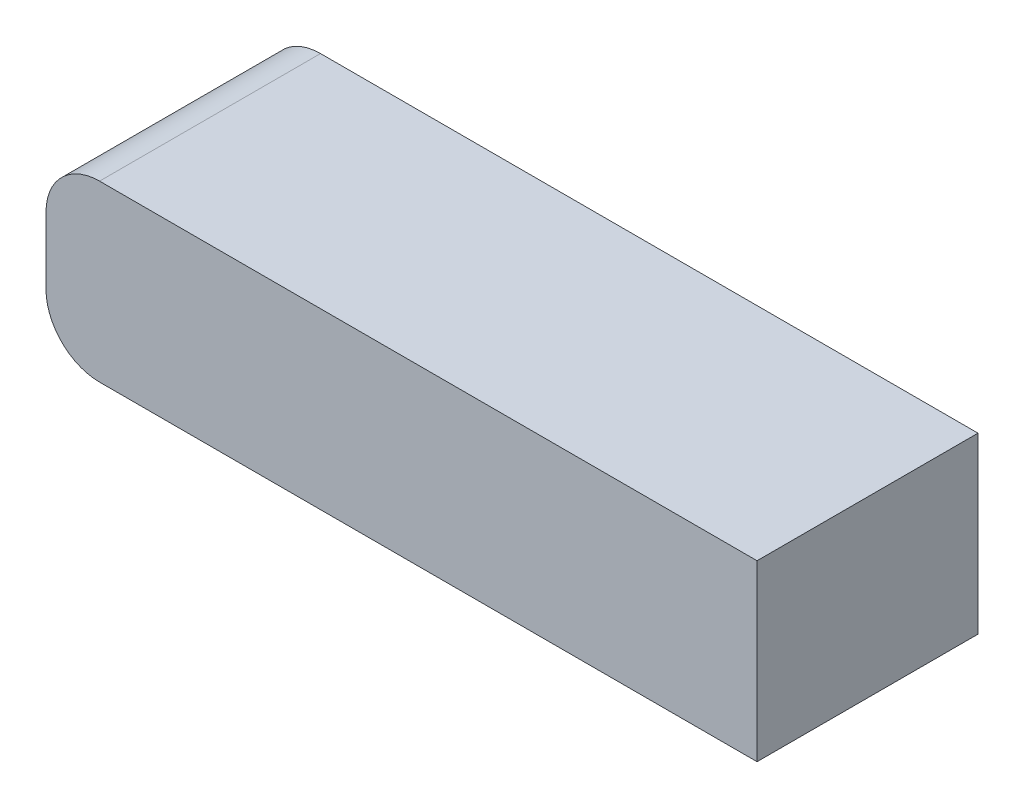
ISO-10303-21;
HEADER;
FILE_DESCRIPTION(('STEP AP214'),'2;1');
FILE_NAME('part.step','',(''),(''),'','','');
FILE_SCHEMA(('AUTOMOTIVE_DESIGN { 1 0 10303 214 1 1 1 1 }'));
ENDSEC;
DATA;
#1=APPLICATION_CONTEXT('core data for automotive mechanical design processes');
#2=APPLICATION_PROTOCOL_DEFINITION('international standard','automotive_design',2000,#1);
#3=PRODUCT_CONTEXT('',#1,'mechanical');
#4=PRODUCT('Part','Part','',(#3));
#5=PRODUCT_RELATED_PRODUCT_CATEGORY('part','',(#4));
#6=PRODUCT_DEFINITION_FORMATION('','',#4);
#7=PRODUCT_DEFINITION_CONTEXT('part definition',#1,'design');
#8=PRODUCT_DEFINITION('design','',#6,#7);
#9=PRODUCT_DEFINITION_SHAPE('','',#8);
#10=(LENGTH_UNIT() NAMED_UNIT(*) SI_UNIT(.MILLI.,.METRE.));
#11=(NAMED_UNIT(*) PLANE_ANGLE_UNIT() SI_UNIT($,.RADIAN.));
#12=(NAMED_UNIT(*) SI_UNIT($,.STERADIAN.) SOLID_ANGLE_UNIT());
#13=UNCERTAINTY_MEASURE_WITH_UNIT(LENGTH_MEASURE(1.E-05),#10,'distance_accuracy_value','');
#14=(GEOMETRIC_REPRESENTATION_CONTEXT(3) GLOBAL_UNCERTAINTY_ASSIGNED_CONTEXT((#13)) GLOBAL_UNIT_ASSIGNED_CONTEXT((#10,
#11,#12)) REPRESENTATION_CONTEXT('',''));
#15=CARTESIAN_POINT('',(0.,0.,0.));
#16=DIRECTION('',(0.,0.,1.));
#17=DIRECTION('',(1.,0.,0.));
#18=AXIS2_PLACEMENT_3D('',#15,#16,#17);
#19=CARTESIAN_POINT('',(67.437,33.02,20.955));
#20=DIRECTION('',(-1.,0.,0.));
#21=DIRECTION('',(0.,0.,1.));
#22=AXIS2_PLACEMENT_3D('',#19,#20,#21);
#23=PLANE('',#22);
#24=DIRECTION('',(0.,0.,-1.));
#25=VECTOR('',#24,1.);
#26=CARTESIAN_POINT('',(67.437,0.,20.955));
#27=LINE('',#26,#25);
#28=CARTESIAN_POINT('',(67.437,0.,20.955));
#29=VERTEX_POINT('',#28);
#30=CARTESIAN_POINT('',(67.437,0.,-20.955));
#31=VERTEX_POINT('',#30);
#32=EDGE_CURVE('E112',#29,#31,#27,.T.);
#33=ORIENTED_EDGE('',*,*,#32,.T.);
#34=DIRECTION('',(0.,-1.,0.));
#35=VECTOR('',#34,1.);
#36=CARTESIAN_POINT('',(67.437,33.02,-20.955));
#37=LINE('',#36,#35);
#38=CARTESIAN_POINT('',(67.437,33.02,-20.955));
#39=VERTEX_POINT('',#38);
#40=EDGE_CURVE('E96',#39,#31,#37,.T.);
#41=ORIENTED_EDGE('',*,*,#40,.F.);
#42=DIRECTION('',(0.,0.,-1.));
#43=VECTOR('',#42,1.);
#44=CARTESIAN_POINT('',(67.437,33.02,20.955));
#45=LINE('',#44,#43);
#46=CARTESIAN_POINT('',(67.437,33.02,20.955));
#47=VERTEX_POINT('',#46);
#48=EDGE_CURVE('E101',#47,#39,#45,.T.);
#49=ORIENTED_EDGE('',*,*,#48,.F.);
#50=DIRECTION('',(0.,-1.,0.));
#51=VECTOR('',#50,1.);
#52=CARTESIAN_POINT('',(67.437,33.02,20.955));
#53=LINE('',#52,#51);
#54=EDGE_CURVE('E147',#47,#29,#53,.T.);
#55=ORIENTED_EDGE('',*,*,#54,.T.);
#56=EDGE_LOOP('',(#33,#41,#49,#55));
#57=FACE_BOUND('',#56,.T.);
#58=ADVANCED_FACE('F39',(#57),#23,.F.);
#59=CARTESIAN_POINT('',(-67.437,33.02,-20.955));
#60=DIRECTION('',(0.,0.,1.));
#61=DIRECTION('',(1.,0.,0.));
#62=AXIS2_PLACEMENT_3D('',#59,#60,#61);
#63=PLANE('',#62);
#64=DIRECTION('',(-1.,0.,0.));
#65=VECTOR('',#64,1.);
#66=CARTESIAN_POINT('',(-67.437,0.,-20.955));
#67=LINE('',#66,#65);
#68=CARTESIAN_POINT('',(-57.277,0.,-20.955));
#69=VERTEX_POINT('',#68);
#70=EDGE_CURVE('E131',#31,#69,#67,.T.);
#71=ORIENTED_EDGE('',*,*,#70,.T.);
#72=CARTESIAN_POINT('',(-57.277,10.16,-20.955));
#73=DIRECTION('',(0.,0.,1.));
#74=DIRECTION('',(1.,0.,0.));
#75=AXIS2_PLACEMENT_3D('',#72,#73,#74);
#76=CIRCLE('',#75,10.16);
#77=CARTESIAN_POINT('',(-67.437,10.16,-20.955));
#78=VERTEX_POINT('',#77);
#79=EDGE_CURVE('E47',#69,#78,#76,.F.);
#80=ORIENTED_EDGE('',*,*,#79,.T.);
#81=DIRECTION('',(0.,-1.,0.));
#82=VECTOR('',#81,1.);
#83=CARTESIAN_POINT('',(-67.437,33.02,-20.955));
#84=LINE('',#83,#82);
#85=CARTESIAN_POINT('',(-67.437,22.86,-20.955));
#86=VERTEX_POINT('',#85);
#87=EDGE_CURVE('E114',#86,#78,#84,.T.);
#88=ORIENTED_EDGE('',*,*,#87,.F.);
#89=CARTESIAN_POINT('',(-57.277,22.86,-20.955));
#90=DIRECTION('',(0.,0.,1.));
#91=DIRECTION('',(1.,0.,0.));
#92=AXIS2_PLACEMENT_3D('',#89,#90,#91);
#93=CIRCLE('',#92,10.16);
#94=CARTESIAN_POINT('',(-57.277,33.02,-20.955));
#95=VERTEX_POINT('',#94);
#96=EDGE_CURVE('E54',#86,#95,#93,.F.);
#97=ORIENTED_EDGE('',*,*,#96,.T.);
#98=DIRECTION('',(-1.,0.,0.));
#99=VECTOR('',#98,1.);
#100=CARTESIAN_POINT('',(-67.437,33.02,-20.955));
#101=LINE('',#100,#99);
#102=EDGE_CURVE('E92',#39,#95,#101,.T.);
#103=ORIENTED_EDGE('',*,*,#102,.F.);
#104=ORIENTED_EDGE('',*,*,#40,.T.);
#105=EDGE_LOOP('',(#71,#80,#88,#97,#103,#104));
#106=FACE_BOUND('',#105,.T.);
#107=ADVANCED_FACE('F94',(#106),#63,.F.);
#108=CARTESIAN_POINT('',(-67.437,33.02,20.955));
#109=DIRECTION('',(1.,0.,0.));
#110=DIRECTION('',(0.,0.,-1.));
#111=AXIS2_PLACEMENT_3D('',#108,#109,#110);
#112=PLANE('',#111);
#113=ORIENTED_EDGE('',*,*,#87,.T.);
#114=DIRECTION('',(0.,0.,1.));
#115=VECTOR('',#114,1.);
#116=CARTESIAN_POINT('',(-67.437,10.16,20.955));
#117=LINE('',#116,#115);
#118=CARTESIAN_POINT('',(-67.437,10.16,20.955));
#119=VERTEX_POINT('',#118);
#120=EDGE_CURVE('E116',#78,#119,#117,.T.);
#121=ORIENTED_EDGE('',*,*,#120,.T.);
#122=DIRECTION('',(0.,-1.,0.));
#123=VECTOR('',#122,1.);
#124=CARTESIAN_POINT('',(-67.437,33.02,20.955));
#125=LINE('',#124,#123);
#126=CARTESIAN_POINT('',(-67.437,22.86,20.955));
#127=VERTEX_POINT('',#126);
#128=EDGE_CURVE('E119',#127,#119,#125,.T.);
#129=ORIENTED_EDGE('',*,*,#128,.F.);
#130=DIRECTION('',(0.,0.,1.));
#131=VECTOR('',#130,1.);
#132=CARTESIAN_POINT('',(-67.437,22.86,20.955));
#133=LINE('',#132,#131);
#134=EDGE_CURVE('E113',#127,#86,#133,.F.);
#135=ORIENTED_EDGE('',*,*,#134,.T.);
#136=EDGE_LOOP('',(#113,#121,#129,#135));
#137=FACE_BOUND('',#136,.T.);
#138=ADVANCED_FACE('F135',(#137),#112,.F.);
#139=CARTESIAN_POINT('',(-67.437,33.02,20.955));
#140=DIRECTION('',(0.,0.,-1.));
#141=DIRECTION('',(-1.,0.,0.));
#142=AXIS2_PLACEMENT_3D('',#139,#140,#141);
#143=PLANE('',#142);
#144=ORIENTED_EDGE('',*,*,#128,.T.);
#145=CARTESIAN_POINT('',(-57.277,10.16,20.955));
#146=DIRECTION('',(0.,0.,-1.));
#147=DIRECTION('',(-1.,0.,0.));
#148=AXIS2_PLACEMENT_3D('',#145,#146,#147);
#149=CIRCLE('',#148,10.16);
#150=CARTESIAN_POINT('',(-57.277,0.,20.955));
#151=VERTEX_POINT('',#150);
#152=EDGE_CURVE('E127',#119,#151,#149,.F.);
#153=ORIENTED_EDGE('',*,*,#152,.T.);
#154=DIRECTION('',(1.,0.,0.));
#155=VECTOR('',#154,1.);
#156=CARTESIAN_POINT('',(-67.437,0.,20.955));
#157=LINE('',#156,#155);
#158=EDGE_CURVE('E109',#151,#29,#157,.T.);
#159=ORIENTED_EDGE('',*,*,#158,.T.);
#160=ORIENTED_EDGE('',*,*,#54,.F.);
#161=DIRECTION('',(1.,0.,0.));
#162=VECTOR('',#161,1.);
#163=CARTESIAN_POINT('',(-67.437,33.02,20.955));
#164=LINE('',#163,#162);
#165=CARTESIAN_POINT('',(-57.277,33.02,20.955));
#166=VERTEX_POINT('',#165);
#167=EDGE_CURVE('E100',#166,#47,#164,.T.);
#168=ORIENTED_EDGE('',*,*,#167,.F.);
#169=CARTESIAN_POINT('',(-57.277,22.86,20.955));
#170=DIRECTION('',(0.,0.,-1.));
#171=DIRECTION('',(-1.,0.,0.));
#172=AXIS2_PLACEMENT_3D('',#169,#170,#171);
#173=CIRCLE('',#172,10.16);
#174=EDGE_CURVE('E125',#166,#127,#173,.F.);
#175=ORIENTED_EDGE('',*,*,#174,.T.);
#176=EDGE_LOOP('',(#144,#153,#159,#160,#168,#175));
#177=FACE_BOUND('',#176,.T.);
#178=ADVANCED_FACE('F141',(#177),#143,.F.);
#179=CARTESIAN_POINT('',(0.,33.02,0.));
#180=DIRECTION('',(0.,-1.,0.));
#181=DIRECTION('',(0.,0.,-1.));
#182=AXIS2_PLACEMENT_3D('',#179,#180,#181);
#183=PLANE('',#182);
#184=ORIENTED_EDGE('',*,*,#102,.T.);
#185=DIRECTION('',(0.,0.,1.));
#186=VECTOR('',#185,1.);
#187=CARTESIAN_POINT('',(-57.277,33.02,0.));
#188=LINE('',#187,#186);
#189=EDGE_CURVE('E11',#95,#166,#188,.T.);
#190=ORIENTED_EDGE('',*,*,#189,.T.);
#191=ORIENTED_EDGE('',*,*,#167,.T.);
#192=ORIENTED_EDGE('',*,*,#48,.T.);
#193=EDGE_LOOP('',(#184,#190,#191,#192));
#194=FACE_BOUND('',#193,.T.);
#195=ADVANCED_FACE('F104',(#194),#183,.F.);
#196=CARTESIAN_POINT('',(0.,0.,0.));
#197=DIRECTION('',(0.,-1.,0.));
#198=DIRECTION('',(0.,0.,-1.));
#199=AXIS2_PLACEMENT_3D('',#196,#197,#198);
#200=PLANE('',#199);
#201=ORIENTED_EDGE('',*,*,#158,.F.);
#202=DIRECTION('',(0.,0.,1.));
#203=VECTOR('',#202,1.);
#204=CARTESIAN_POINT('',(-57.277,0.,-20.955));
#205=LINE('',#204,#203);
#206=EDGE_CURVE('E62',#151,#69,#205,.F.);
#207=ORIENTED_EDGE('',*,*,#206,.T.);
#208=ORIENTED_EDGE('',*,*,#70,.F.);
#209=ORIENTED_EDGE('',*,*,#32,.F.);
#210=EDGE_LOOP('',(#201,#207,#208,#209));
#211=FACE_BOUND('',#210,.T.);
#212=ADVANCED_FACE('F142',(#211),#200,.T.);
#213=CARTESIAN_POINT('',(-57.277,10.16,20.955));
#214=DIRECTION('',(0.,0.,-1.));
#215=DIRECTION('',(-1.,0.,0.));
#216=AXIS2_PLACEMENT_3D('',#213,#214,#215);
#217=CYLINDRICAL_SURFACE('',#216,10.16);
#218=ORIENTED_EDGE('',*,*,#79,.F.);
#219=ORIENTED_EDGE('',*,*,#206,.F.);
#220=ORIENTED_EDGE('',*,*,#152,.F.);
#221=ORIENTED_EDGE('',*,*,#120,.F.);
#222=EDGE_LOOP('',(#218,#219,#220,#221));
#223=FACE_BOUND('',#222,.T.);
#224=ADVANCED_FACE('F139',(#223),#217,.T.);
#225=CARTESIAN_POINT('',(-57.277,22.86,0.));
#226=DIRECTION('',(0.,0.,1.));
#227=DIRECTION('',(1.,0.,0.));
#228=AXIS2_PLACEMENT_3D('',#225,#226,#227);
#229=CYLINDRICAL_SURFACE('',#228,10.16);
#230=ORIENTED_EDGE('',*,*,#96,.F.);
#231=ORIENTED_EDGE('',*,*,#134,.F.);
#232=ORIENTED_EDGE('',*,*,#174,.F.);
#233=ORIENTED_EDGE('',*,*,#189,.F.);
#234=EDGE_LOOP('',(#230,#231,#232,#233));
#235=FACE_BOUND('',#234,.T.);
#236=ADVANCED_FACE('F41',(#235),#229,.T.);
#237=CLOSED_SHELL('',(#58,#107,#138,#178,#195,#212,#224,#236));
#238=MANIFOLD_SOLID_BREP('B2',#237);
#239=ADVANCED_BREP_SHAPE_REPRESENTATION('',(#18,#238),#14);
#240=SHAPE_DEFINITION_REPRESENTATION(#9,#239);
ENDSEC;
END-ISO-10303-21;
